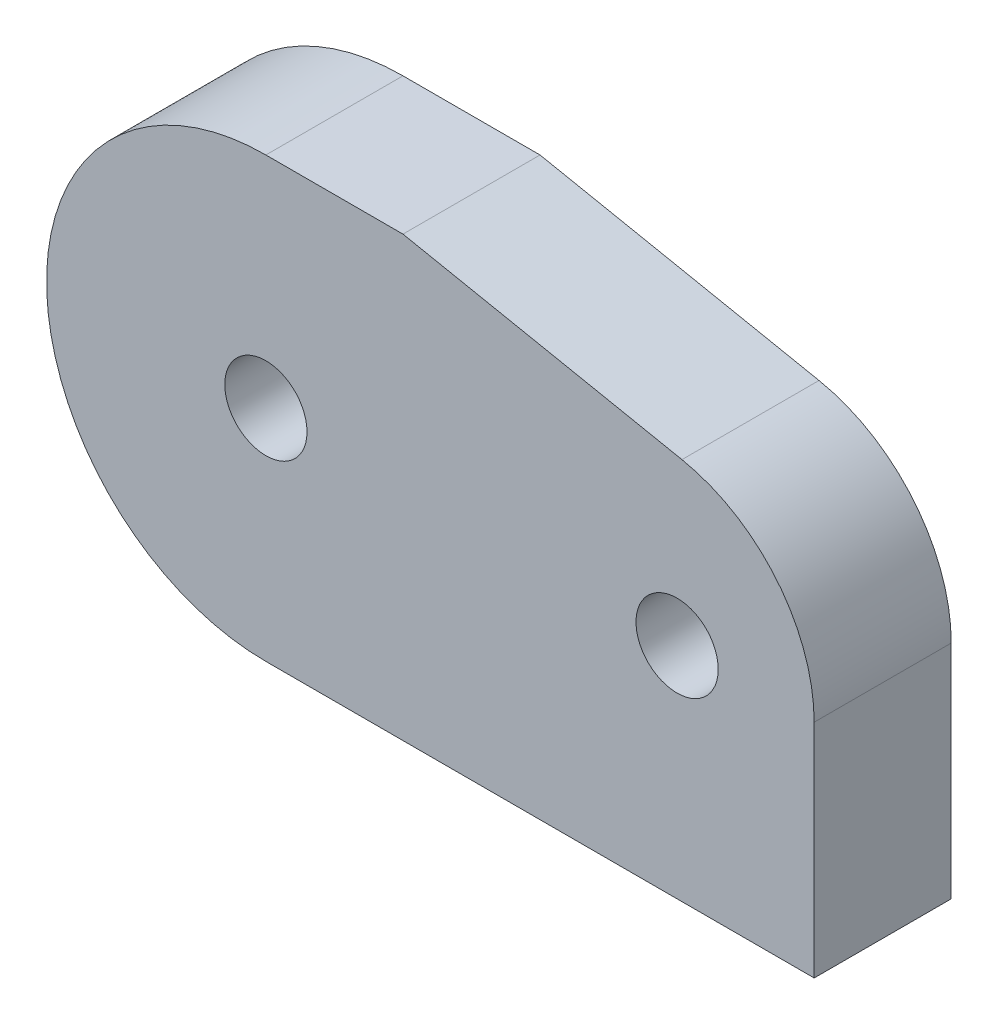
ISO-10303-21;
HEADER;
FILE_DESCRIPTION(('STEP AP214'),'2;1');
FILE_NAME('part.step','',(''),(''),'','','');
FILE_SCHEMA(('AUTOMOTIVE_DESIGN { 1 0 10303 214 1 1 1 1 }'));
ENDSEC;
DATA;
#1=APPLICATION_CONTEXT('core data for automotive mechanical design processes');
#2=APPLICATION_PROTOCOL_DEFINITION('international standard','automotive_design',2000,#1);
#3=PRODUCT_CONTEXT('',#1,'mechanical');
#4=PRODUCT('Part','Part','',(#3));
#5=PRODUCT_RELATED_PRODUCT_CATEGORY('part','',(#4));
#6=PRODUCT_DEFINITION_FORMATION('','',#4);
#7=PRODUCT_DEFINITION_CONTEXT('part definition',#1,'design');
#8=PRODUCT_DEFINITION('design','',#6,#7);
#9=PRODUCT_DEFINITION_SHAPE('','',#8);
#10=(LENGTH_UNIT() NAMED_UNIT(*) SI_UNIT(.MILLI.,.METRE.));
#11=(NAMED_UNIT(*) PLANE_ANGLE_UNIT() SI_UNIT($,.RADIAN.));
#12=(NAMED_UNIT(*) SI_UNIT($,.STERADIAN.) SOLID_ANGLE_UNIT());
#13=UNCERTAINTY_MEASURE_WITH_UNIT(LENGTH_MEASURE(1.E-05),#10,'distance_accuracy_value','');
#14=(GEOMETRIC_REPRESENTATION_CONTEXT(3) GLOBAL_UNCERTAINTY_ASSIGNED_CONTEXT((#13)) GLOBAL_UNIT_ASSIGNED_CONTEXT((#10,
#11,#12)) REPRESENTATION_CONTEXT('',''));
#15=CARTESIAN_POINT('',(0.,0.,0.));
#16=DIRECTION('',(0.,0.,1.));
#17=DIRECTION('',(1.,0.,0.));
#18=AXIS2_PLACEMENT_3D('',#15,#16,#17);
#19=CARTESIAN_POINT('',(0.,0.,5.));
#20=DIRECTION('',(0.,0.,1.));
#21=DIRECTION('',(1.,0.,0.));
#22=AXIS2_PLACEMENT_3D('',#19,#20,#21);
#23=PLANE('',#22);
#24=CARTESIAN_POINT('',(0.,0.,5.));
#25=DIRECTION('',(0.,0.,1.));
#26=DIRECTION('',(1.,0.,0.));
#27=AXIS2_PLACEMENT_3D('',#24,#25,#26);
#28=CIRCLE('',#27,1.5);
#29=CARTESIAN_POINT('',(1.5,0.,5.));
#30=VERTEX_POINT('',#29);
#31=EDGE_CURVE('E132',#30,#30,#28,.T.);
#32=ORIENTED_EDGE('',*,*,#31,.F.);
#33=EDGE_LOOP('',(#32));
#34=FACE_BOUND('',#33,.T.);
#35=DIRECTION('',(0.,1.,0.));
#36=VECTOR('',#35,1.);
#37=CARTESIAN_POINT('',(20.,-8.,5.));
#38=LINE('',#37,#36);
#39=CARTESIAN_POINT('',(20.,-8.,5.));
#40=VERTEX_POINT('',#39);
#41=CARTESIAN_POINT('',(20.,0.0811765836886535,5.));
#42=VERTEX_POINT('',#41);
#43=EDGE_CURVE('E97',#40,#42,#38,.T.);
#44=ORIENTED_EDGE('',*,*,#43,.T.);
#45=CARTESIAN_POINT('',(14.,0.0811765836886565,5.));
#46=DIRECTION('',(0.,0.,1.));
#47=DIRECTION('',(1.,0.,0.));
#48=AXIS2_PLACEMENT_3D('',#45,#46,#47);
#49=CIRCLE('',#48,6.);
#50=CARTESIAN_POINT('',(15.1766968108291,5.96466063783418,5.));
#51=VERTEX_POINT('',#50);
#52=EDGE_CURVE('E11',#42,#51,#49,.T.);
#53=ORIENTED_EDGE('',*,*,#52,.T.);
#54=DIRECTION('',(-0.98058067569092,0.196116135138184,0.));
#55=VECTOR('',#54,1.);
#56=CARTESIAN_POINT('',(20.,5.,5.));
#57=LINE('',#56,#55);
#58=CARTESIAN_POINT('',(5.,8.,5.));
#59=VERTEX_POINT('',#58);
#60=EDGE_CURVE('E134',#51,#59,#57,.T.);
#61=ORIENTED_EDGE('',*,*,#60,.T.);
#62=DIRECTION('',(-1.,0.,0.));
#63=VECTOR('',#62,1.);
#64=CARTESIAN_POINT('',(0.,8.,5.));
#65=LINE('',#64,#63);
#66=CARTESIAN_POINT('',(0.,8.,5.));
#67=VERTEX_POINT('',#66);
#68=EDGE_CURVE('E103',#59,#67,#65,.T.);
#69=ORIENTED_EDGE('',*,*,#68,.T.);
#70=CARTESIAN_POINT('',(0.,0.,5.));
#71=DIRECTION('',(0.,0.,1.));
#72=DIRECTION('',(1.,0.,0.));
#73=AXIS2_PLACEMENT_3D('',#70,#71,#72);
#74=CIRCLE('',#73,8.);
#75=CARTESIAN_POINT('',(0.,-8.,5.));
#76=VERTEX_POINT('',#75);
#77=EDGE_CURVE('E98',#67,#76,#74,.T.);
#78=ORIENTED_EDGE('',*,*,#77,.T.);
#79=DIRECTION('',(1.,0.,0.));
#80=VECTOR('',#79,1.);
#81=CARTESIAN_POINT('',(0.,-8.,5.));
#82=LINE('',#81,#80);
#83=EDGE_CURVE('E88',#76,#40,#82,.T.);
#84=ORIENTED_EDGE('',*,*,#83,.T.);
#85=EDGE_LOOP('',(#44,#53,#61,#69,#78,#84));
#86=FACE_BOUND('',#85,.T.);
#87=CARTESIAN_POINT('',(15.,0.,5.));
#88=DIRECTION('',(0.,0.,1.));
#89=DIRECTION('',(1.,0.,0.));
#90=AXIS2_PLACEMENT_3D('',#87,#88,#89);
#91=CIRCLE('',#90,1.5);
#92=CARTESIAN_POINT('',(16.5,0.,5.));
#93=VERTEX_POINT('',#92);
#94=EDGE_CURVE('E140',#93,#93,#91,.T.);
#95=ORIENTED_EDGE('',*,*,#94,.F.);
#96=EDGE_LOOP('',(#95));
#97=FACE_BOUND('',#96,.T.);
#98=ADVANCED_FACE('F35',(#34,#86,#97),#23,.T.);
#99=CARTESIAN_POINT('',(0.,0.,0.));
#100=DIRECTION('',(0.,0.,1.));
#101=DIRECTION('',(1.,0.,0.));
#102=AXIS2_PLACEMENT_3D('',#99,#100,#101);
#103=PLANE('',#102);
#104=CARTESIAN_POINT('',(0.,0.,0.));
#105=DIRECTION('',(0.,0.,1.));
#106=DIRECTION('',(1.,0.,0.));
#107=AXIS2_PLACEMENT_3D('',#104,#105,#106);
#108=CIRCLE('',#107,1.5);
#109=CARTESIAN_POINT('',(1.5,0.,0.));
#110=VERTEX_POINT('',#109);
#111=EDGE_CURVE('E137',#110,#110,#108,.T.);
#112=ORIENTED_EDGE('',*,*,#111,.T.);
#113=EDGE_LOOP('',(#112));
#114=FACE_BOUND('',#113,.T.);
#115=DIRECTION('',(-0.98058067569092,0.196116135138184,0.));
#116=VECTOR('',#115,1.);
#117=CARTESIAN_POINT('',(20.,5.,0.));
#118=LINE('',#117,#116);
#119=CARTESIAN_POINT('',(15.1766968108291,5.96466063783418,0.));
#120=VERTEX_POINT('',#119);
#121=CARTESIAN_POINT('',(5.,8.,0.));
#122=VERTEX_POINT('',#121);
#123=EDGE_CURVE('E125',#120,#122,#118,.T.);
#124=ORIENTED_EDGE('',*,*,#123,.F.);
#125=CARTESIAN_POINT('',(14.,0.0811765836886565,0.));
#126=DIRECTION('',(0.,0.,1.));
#127=DIRECTION('',(1.,0.,0.));
#128=AXIS2_PLACEMENT_3D('',#125,#126,#127);
#129=CIRCLE('',#128,6.);
#130=CARTESIAN_POINT('',(20.,0.0811765836886535,0.));
#131=VERTEX_POINT('',#130);
#132=EDGE_CURVE('E57',#120,#131,#129,.F.);
#133=ORIENTED_EDGE('',*,*,#132,.T.);
#134=DIRECTION('',(0.,1.,0.));
#135=VECTOR('',#134,1.);
#136=CARTESIAN_POINT('',(20.,-8.,0.));
#137=LINE('',#136,#135);
#138=CARTESIAN_POINT('',(20.,-8.,0.));
#139=VERTEX_POINT('',#138);
#140=EDGE_CURVE('E127',#139,#131,#137,.T.);
#141=ORIENTED_EDGE('',*,*,#140,.F.);
#142=DIRECTION('',(1.,0.,0.));
#143=VECTOR('',#142,1.);
#144=CARTESIAN_POINT('',(0.,-8.,0.));
#145=LINE('',#144,#143);
#146=CARTESIAN_POINT('',(0.,-8.,0.));
#147=VERTEX_POINT('',#146);
#148=EDGE_CURVE('E129',#147,#139,#145,.T.);
#149=ORIENTED_EDGE('',*,*,#148,.F.);
#150=CARTESIAN_POINT('',(0.,0.,0.));
#151=DIRECTION('',(0.,0.,1.));
#152=DIRECTION('',(1.,0.,0.));
#153=AXIS2_PLACEMENT_3D('',#150,#151,#152);
#154=CIRCLE('',#153,8.);
#155=CARTESIAN_POINT('',(0.,8.,0.));
#156=VERTEX_POINT('',#155);
#157=EDGE_CURVE('E111',#156,#147,#154,.T.);
#158=ORIENTED_EDGE('',*,*,#157,.F.);
#159=DIRECTION('',(-1.,0.,0.));
#160=VECTOR('',#159,1.);
#161=CARTESIAN_POINT('',(0.,8.,0.));
#162=LINE('',#161,#160);
#163=EDGE_CURVE('E107',#122,#156,#162,.T.);
#164=ORIENTED_EDGE('',*,*,#163,.F.);
#165=EDGE_LOOP('',(#124,#133,#141,#149,#158,#164));
#166=FACE_BOUND('',#165,.T.);
#167=CARTESIAN_POINT('',(15.,0.,0.));
#168=DIRECTION('',(0.,0.,1.));
#169=DIRECTION('',(1.,0.,0.));
#170=AXIS2_PLACEMENT_3D('',#167,#168,#169);
#171=CIRCLE('',#170,1.5);
#172=CARTESIAN_POINT('',(16.5,0.,0.));
#173=VERTEX_POINT('',#172);
#174=EDGE_CURVE('E143',#173,#173,#171,.T.);
#175=ORIENTED_EDGE('',*,*,#174,.T.);
#176=EDGE_LOOP('',(#175));
#177=FACE_BOUND('',#176,.T.);
#178=ADVANCED_FACE('F152',(#114,#166,#177),#103,.F.);
#179=CARTESIAN_POINT('',(0.,0.,5.));
#180=DIRECTION('',(0.,0.,-1.));
#181=DIRECTION('',(-1.,0.,0.));
#182=AXIS2_PLACEMENT_3D('',#179,#180,#181);
#183=CYLINDRICAL_SURFACE('',#182,8.);
#184=ORIENTED_EDGE('',*,*,#157,.T.);
#185=DIRECTION('',(0.,0.,-1.));
#186=VECTOR('',#185,1.);
#187=CARTESIAN_POINT('',(0.,-8.,5.));
#188=LINE('',#187,#186);
#189=EDGE_CURVE('E92',#76,#147,#188,.T.);
#190=ORIENTED_EDGE('',*,*,#189,.F.);
#191=ORIENTED_EDGE('',*,*,#77,.F.);
#192=DIRECTION('',(0.,0.,-1.));
#193=VECTOR('',#192,1.);
#194=CARTESIAN_POINT('',(0.,8.,5.));
#195=LINE('',#194,#193);
#196=EDGE_CURVE('E122',#67,#156,#195,.T.);
#197=ORIENTED_EDGE('',*,*,#196,.T.);
#198=EDGE_LOOP('',(#184,#190,#191,#197));
#199=FACE_BOUND('',#198,.T.);
#200=ADVANCED_FACE('F109',(#199),#183,.T.);
#201=CARTESIAN_POINT('',(0.,-8.,5.));
#202=DIRECTION('',(0.,1.,0.));
#203=DIRECTION('',(0.,0.,1.));
#204=AXIS2_PLACEMENT_3D('',#201,#202,#203);
#205=PLANE('',#204);
#206=ORIENTED_EDGE('',*,*,#148,.T.);
#207=DIRECTION('',(0.,0.,-1.));
#208=VECTOR('',#207,1.);
#209=CARTESIAN_POINT('',(20.,-8.,5.));
#210=LINE('',#209,#208);
#211=EDGE_CURVE('E95',#40,#139,#210,.T.);
#212=ORIENTED_EDGE('',*,*,#211,.F.);
#213=ORIENTED_EDGE('',*,*,#83,.F.);
#214=ORIENTED_EDGE('',*,*,#189,.T.);
#215=EDGE_LOOP('',(#206,#212,#213,#214));
#216=FACE_BOUND('',#215,.T.);
#217=ADVANCED_FACE('F90',(#216),#205,.F.);
#218=CARTESIAN_POINT('',(20.,-8.,5.));
#219=DIRECTION('',(-1.,0.,0.));
#220=DIRECTION('',(0.,0.,1.));
#221=AXIS2_PLACEMENT_3D('',#218,#219,#220);
#222=PLANE('',#221);
#223=ORIENTED_EDGE('',*,*,#140,.T.);
#224=DIRECTION('',(0.,0.,-1.));
#225=VECTOR('',#224,1.);
#226=CARTESIAN_POINT('',(20.,0.0811765836886569,5.));
#227=LINE('',#226,#225);
#228=EDGE_CURVE('E43',#131,#42,#227,.F.);
#229=ORIENTED_EDGE('',*,*,#228,.T.);
#230=ORIENTED_EDGE('',*,*,#43,.F.);
#231=ORIENTED_EDGE('',*,*,#211,.T.);
#232=EDGE_LOOP('',(#223,#229,#230,#231));
#233=FACE_BOUND('',#232,.T.);
#234=ADVANCED_FACE('F172',(#233),#222,.F.);
#235=CARTESIAN_POINT('',(20.,5.,5.));
#236=DIRECTION('',(-0.196116135138184,-0.98058067569092,0.));
#237=DIRECTION('',(0.98058067569092,-0.196116135138184,0.));
#238=AXIS2_PLACEMENT_3D('',#235,#236,#237);
#239=PLANE('',#238);
#240=ORIENTED_EDGE('',*,*,#60,.F.);
#241=DIRECTION('',(0.,0.,-1.));
#242=VECTOR('',#241,1.);
#243=CARTESIAN_POINT('',(15.1766968108291,5.96466063783418,5.));
#244=LINE('',#243,#242);
#245=EDGE_CURVE('E112',#51,#120,#244,.T.);
#246=ORIENTED_EDGE('',*,*,#245,.T.);
#247=ORIENTED_EDGE('',*,*,#123,.T.);
#248=DIRECTION('',(0.,0.,-1.));
#249=VECTOR('',#248,1.);
#250=CARTESIAN_POINT('',(5.,8.,5.));
#251=LINE('',#250,#249);
#252=EDGE_CURVE('E116',#59,#122,#251,.T.);
#253=ORIENTED_EDGE('',*,*,#252,.F.);
#254=EDGE_LOOP('',(#240,#246,#247,#253));
#255=FACE_BOUND('',#254,.T.);
#256=ADVANCED_FACE('F168',(#255),#239,.F.);
#257=CARTESIAN_POINT('',(0.,8.,5.));
#258=DIRECTION('',(0.,-1.,0.));
#259=DIRECTION('',(0.,0.,-1.));
#260=AXIS2_PLACEMENT_3D('',#257,#258,#259);
#261=PLANE('',#260);
#262=ORIENTED_EDGE('',*,*,#163,.T.);
#263=ORIENTED_EDGE('',*,*,#196,.F.);
#264=ORIENTED_EDGE('',*,*,#68,.F.);
#265=ORIENTED_EDGE('',*,*,#252,.T.);
#266=EDGE_LOOP('',(#262,#263,#264,#265));
#267=FACE_BOUND('',#266,.T.);
#268=ADVANCED_FACE('F165',(#267),#261,.F.);
#269=CARTESIAN_POINT('',(0.,0.,5.));
#270=DIRECTION('',(0.,0.,-1.));
#271=DIRECTION('',(-1.,0.,0.));
#272=AXIS2_PLACEMENT_3D('',#269,#270,#271);
#273=CYLINDRICAL_SURFACE('',#272,1.5);
#274=ORIENTED_EDGE('',*,*,#31,.T.);
#275=EDGE_LOOP('',(#274));
#276=FACE_BOUND('',#275,.T.);
#277=ORIENTED_EDGE('',*,*,#111,.F.);
#278=EDGE_LOOP('',(#277));
#279=FACE_BOUND('',#278,.T.);
#280=ADVANCED_FACE('F162',(#276,#279),#273,.F.);
#281=CARTESIAN_POINT('',(15.,0.,5.));
#282=DIRECTION('',(0.,0.,-1.));
#283=DIRECTION('',(-1.,0.,0.));
#284=AXIS2_PLACEMENT_3D('',#281,#282,#283);
#285=CYLINDRICAL_SURFACE('',#284,1.5);
#286=ORIENTED_EDGE('',*,*,#94,.T.);
#287=EDGE_LOOP('',(#286));
#288=FACE_BOUND('',#287,.T.);
#289=ORIENTED_EDGE('',*,*,#174,.F.);
#290=EDGE_LOOP('',(#289));
#291=FACE_BOUND('',#290,.T.);
#292=ADVANCED_FACE('F149',(#288,#291),#285,.F.);
#293=CARTESIAN_POINT('',(14.,0.0811765836886565,5.));
#294=DIRECTION('',(0.,0.,-1.));
#295=DIRECTION('',(-1.,0.,0.));
#296=AXIS2_PLACEMENT_3D('',#293,#294,#295);
#297=CYLINDRICAL_SURFACE('',#296,6.);
#298=ORIENTED_EDGE('',*,*,#52,.F.);
#299=ORIENTED_EDGE('',*,*,#228,.F.);
#300=ORIENTED_EDGE('',*,*,#132,.F.);
#301=ORIENTED_EDGE('',*,*,#245,.F.);
#302=EDGE_LOOP('',(#298,#299,#300,#301));
#303=FACE_BOUND('',#302,.T.);
#304=ADVANCED_FACE('F37',(#303),#297,.T.);
#305=CLOSED_SHELL('',(#98,#178,#200,#217,#234,#256,#268,#280,#292,#304));
#306=MANIFOLD_SOLID_BREP('B2',#305);
#307=ADVANCED_BREP_SHAPE_REPRESENTATION('',(#18,#306),#14);
#308=SHAPE_DEFINITION_REPRESENTATION(#9,#307);
ENDSEC;
END-ISO-10303-21;
